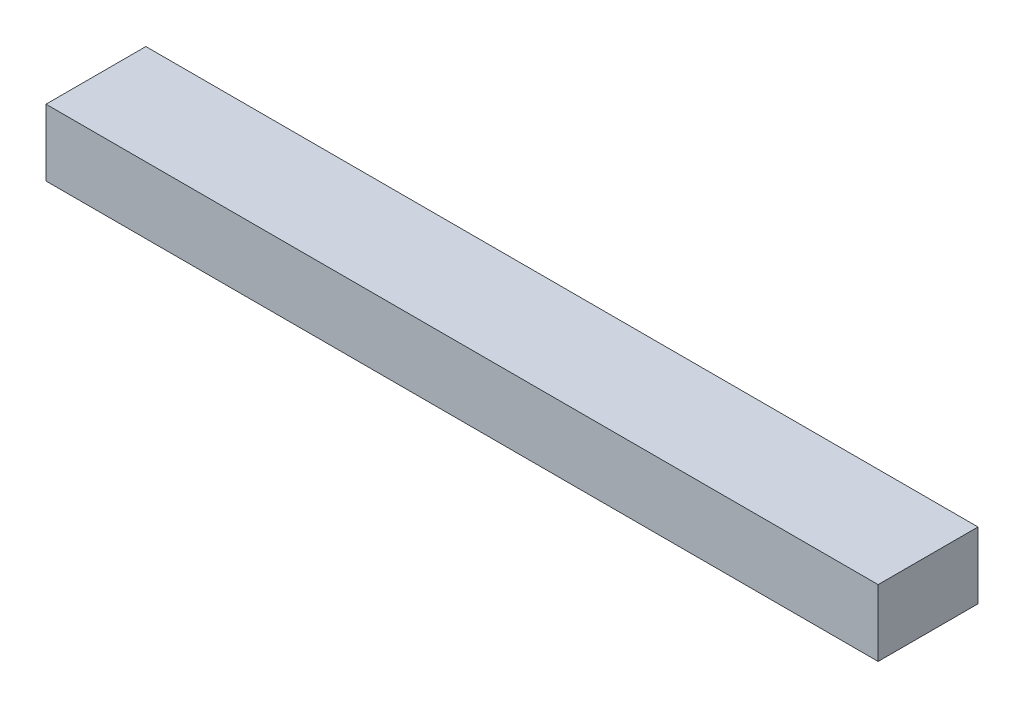
ISO-10303-21;
HEADER;
FILE_DESCRIPTION(('STEP AP214'),'2;1');
FILE_NAME('part.step','',(''),(''),'','','');
FILE_SCHEMA(('AUTOMOTIVE_DESIGN { 1 0 10303 214 1 1 1 1 }'));
ENDSEC;
DATA;
#1=APPLICATION_CONTEXT('core data for automotive mechanical design processes');
#2=APPLICATION_PROTOCOL_DEFINITION('international standard','automotive_design',2000,#1);
#3=PRODUCT_CONTEXT('',#1,'mechanical');
#4=PRODUCT('Part','Part','',(#3));
#5=PRODUCT_RELATED_PRODUCT_CATEGORY('part','',(#4));
#6=PRODUCT_DEFINITION_FORMATION('','',#4);
#7=PRODUCT_DEFINITION_CONTEXT('part definition',#1,'design');
#8=PRODUCT_DEFINITION('design','',#6,#7);
#9=PRODUCT_DEFINITION_SHAPE('','',#8);
#10=(LENGTH_UNIT() NAMED_UNIT(*) SI_UNIT(.MILLI.,.METRE.));
#11=(NAMED_UNIT(*) PLANE_ANGLE_UNIT() SI_UNIT($,.RADIAN.));
#12=(NAMED_UNIT(*) SI_UNIT($,.STERADIAN.) SOLID_ANGLE_UNIT());
#13=UNCERTAINTY_MEASURE_WITH_UNIT(LENGTH_MEASURE(1.E-05),#10,'distance_accuracy_value','');
#14=(GEOMETRIC_REPRESENTATION_CONTEXT(3) GLOBAL_UNCERTAINTY_ASSIGNED_CONTEXT((#13)) GLOBAL_UNIT_ASSIGNED_CONTEXT((#10,
#11,#12)) REPRESENTATION_CONTEXT('',''));
#15=CARTESIAN_POINT('',(0.,0.,0.));
#16=DIRECTION('',(0.,0.,1.));
#17=DIRECTION('',(1.,0.,0.));
#18=AXIS2_PLACEMENT_3D('',#15,#16,#17);
#19=CARTESIAN_POINT('',(50.,8.,6.));
#20=DIRECTION('',(-1.,0.,0.));
#21=DIRECTION('',(0.,0.,1.));
#22=AXIS2_PLACEMENT_3D('',#19,#20,#21);
#23=PLANE('',#22);
#24=DIRECTION('',(0.,0.,-1.));
#25=VECTOR('',#24,1.);
#26=CARTESIAN_POINT('',(50.,0.,6.));
#27=LINE('',#26,#25);
#28=CARTESIAN_POINT('',(50.,0.,6.));
#29=VERTEX_POINT('',#28);
#30=CARTESIAN_POINT('',(50.,0.,-6.));
#31=VERTEX_POINT('',#30);
#32=EDGE_CURVE('E95',#29,#31,#27,.T.);
#33=ORIENTED_EDGE('',*,*,#32,.T.);
#34=DIRECTION('',(0.,-1.,0.));
#35=VECTOR('',#34,1.);
#36=CARTESIAN_POINT('',(50.,8.,-6.));
#37=LINE('',#36,#35);
#38=CARTESIAN_POINT('',(50.,8.,-6.));
#39=VERTEX_POINT('',#38);
#40=EDGE_CURVE('E11',#39,#31,#37,.T.);
#41=ORIENTED_EDGE('',*,*,#40,.F.);
#42=DIRECTION('',(0.,0.,-1.));
#43=VECTOR('',#42,1.);
#44=CARTESIAN_POINT('',(50.,8.,6.));
#45=LINE('',#44,#43);
#46=CARTESIAN_POINT('',(50.,8.,6.));
#47=VERTEX_POINT('',#46);
#48=EDGE_CURVE('E83',#47,#39,#45,.T.);
#49=ORIENTED_EDGE('',*,*,#48,.F.);
#50=DIRECTION('',(0.,-1.,0.));
#51=VECTOR('',#50,1.);
#52=CARTESIAN_POINT('',(50.,8.,6.));
#53=LINE('',#52,#51);
#54=EDGE_CURVE('E91',#47,#29,#53,.T.);
#55=ORIENTED_EDGE('',*,*,#54,.T.);
#56=EDGE_LOOP('',(#33,#41,#49,#55));
#57=FACE_BOUND('',#56,.T.);
#58=ADVANCED_FACE('F32',(#57),#23,.F.);
#59=CARTESIAN_POINT('',(-50.,8.,-6.));
#60=DIRECTION('',(0.,0.,1.));
#61=DIRECTION('',(1.,0.,0.));
#62=AXIS2_PLACEMENT_3D('',#59,#60,#61);
#63=PLANE('',#62);
#64=DIRECTION('',(-1.,0.,0.));
#65=VECTOR('',#64,1.);
#66=CARTESIAN_POINT('',(-50.,0.,-6.));
#67=LINE('',#66,#65);
#68=CARTESIAN_POINT('',(-50.,0.,-6.));
#69=VERTEX_POINT('',#68);
#70=EDGE_CURVE('E87',#31,#69,#67,.T.);
#71=ORIENTED_EDGE('',*,*,#70,.T.);
#72=DIRECTION('',(0.,-1.,0.));
#73=VECTOR('',#72,1.);
#74=CARTESIAN_POINT('',(-50.,8.,-6.));
#75=LINE('',#74,#73);
#76=CARTESIAN_POINT('',(-50.,8.,-6.));
#77=VERTEX_POINT('',#76);
#78=EDGE_CURVE('E40',#77,#69,#75,.T.);
#79=ORIENTED_EDGE('',*,*,#78,.F.);
#80=DIRECTION('',(-1.,0.,0.));
#81=VECTOR('',#80,1.);
#82=CARTESIAN_POINT('',(-50.,8.,-6.));
#83=LINE('',#82,#81);
#84=EDGE_CURVE('E78',#39,#77,#83,.T.);
#85=ORIENTED_EDGE('',*,*,#84,.F.);
#86=ORIENTED_EDGE('',*,*,#40,.T.);
#87=EDGE_LOOP('',(#71,#79,#85,#86));
#88=FACE_BOUND('',#87,.T.);
#89=ADVANCED_FACE('F86',(#88),#63,.F.);
#90=CARTESIAN_POINT('',(-50.,8.,6.));
#91=DIRECTION('',(1.,0.,0.));
#92=DIRECTION('',(0.,0.,-1.));
#93=AXIS2_PLACEMENT_3D('',#90,#91,#92);
#94=PLANE('',#93);
#95=DIRECTION('',(0.,0.,1.));
#96=VECTOR('',#95,1.);
#97=CARTESIAN_POINT('',(-50.,0.,6.));
#98=LINE('',#97,#96);
#99=CARTESIAN_POINT('',(-50.,0.,6.));
#100=VERTEX_POINT('',#99);
#101=EDGE_CURVE('E65',#69,#100,#98,.T.);
#102=ORIENTED_EDGE('',*,*,#101,.T.);
#103=DIRECTION('',(0.,-1.,0.));
#104=VECTOR('',#103,1.);
#105=CARTESIAN_POINT('',(-50.,8.,6.));
#106=LINE('',#105,#104);
#107=CARTESIAN_POINT('',(-50.,8.,6.));
#108=VERTEX_POINT('',#107);
#109=EDGE_CURVE('E88',#108,#100,#106,.T.);
#110=ORIENTED_EDGE('',*,*,#109,.F.);
#111=DIRECTION('',(0.,0.,1.));
#112=VECTOR('',#111,1.);
#113=CARTESIAN_POINT('',(-50.,8.,6.));
#114=LINE('',#113,#112);
#115=EDGE_CURVE('E81',#77,#108,#114,.T.);
#116=ORIENTED_EDGE('',*,*,#115,.F.);
#117=ORIENTED_EDGE('',*,*,#78,.T.);
#118=EDGE_LOOP('',(#102,#110,#116,#117));
#119=FACE_BOUND('',#118,.T.);
#120=ADVANCED_FACE('F89',(#119),#94,.F.);
#121=CARTESIAN_POINT('',(-50.,8.,6.));
#122=DIRECTION('',(0.,0.,-1.));
#123=DIRECTION('',(-1.,0.,0.));
#124=AXIS2_PLACEMENT_3D('',#121,#122,#123);
#125=PLANE('',#124);
#126=DIRECTION('',(1.,0.,0.));
#127=VECTOR('',#126,1.);
#128=CARTESIAN_POINT('',(-50.,0.,6.));
#129=LINE('',#128,#127);
#130=EDGE_CURVE('E71',#100,#29,#129,.T.);
#131=ORIENTED_EDGE('',*,*,#130,.T.);
#132=ORIENTED_EDGE('',*,*,#54,.F.);
#133=DIRECTION('',(1.,0.,0.));
#134=VECTOR('',#133,1.);
#135=CARTESIAN_POINT('',(-50.,8.,6.));
#136=LINE('',#135,#134);
#137=EDGE_CURVE('E48',#108,#47,#136,.T.);
#138=ORIENTED_EDGE('',*,*,#137,.F.);
#139=ORIENTED_EDGE('',*,*,#109,.T.);
#140=EDGE_LOOP('',(#131,#132,#138,#139));
#141=FACE_BOUND('',#140,.T.);
#142=ADVANCED_FACE('F102',(#141),#125,.F.);
#143=CARTESIAN_POINT('',(0.,8.,0.));
#144=DIRECTION('',(0.,-1.,0.));
#145=DIRECTION('',(0.,0.,-1.));
#146=AXIS2_PLACEMENT_3D('',#143,#144,#145);
#147=PLANE('',#146);
#148=ORIENTED_EDGE('',*,*,#48,.T.);
#149=ORIENTED_EDGE('',*,*,#84,.T.);
#150=ORIENTED_EDGE('',*,*,#115,.T.);
#151=ORIENTED_EDGE('',*,*,#137,.T.);
#152=EDGE_LOOP('',(#148,#149,#150,#151));
#153=FACE_BOUND('',#152,.T.);
#154=ADVANCED_FACE('F79',(#153),#147,.F.);
#155=CARTESIAN_POINT('',(0.,0.,0.));
#156=DIRECTION('',(0.,-1.,0.));
#157=DIRECTION('',(0.,0.,-1.));
#158=AXIS2_PLACEMENT_3D('',#155,#156,#157);
#159=PLANE('',#158);
#160=ORIENTED_EDGE('',*,*,#32,.F.);
#161=ORIENTED_EDGE('',*,*,#130,.F.);
#162=ORIENTED_EDGE('',*,*,#101,.F.);
#163=ORIENTED_EDGE('',*,*,#70,.F.);
#164=EDGE_LOOP('',(#160,#161,#162,#163));
#165=FACE_BOUND('',#164,.T.);
#166=ADVANCED_FACE('F105',(#165),#159,.T.);
#167=CLOSED_SHELL('',(#58,#89,#120,#142,#154,#166));
#168=MANIFOLD_SOLID_BREP('B2',#167);
#169=ADVANCED_BREP_SHAPE_REPRESENTATION('',(#18,#168),#14);
#170=SHAPE_DEFINITION_REPRESENTATION(#9,#169);
ENDSEC;
END-ISO-10303-21;
